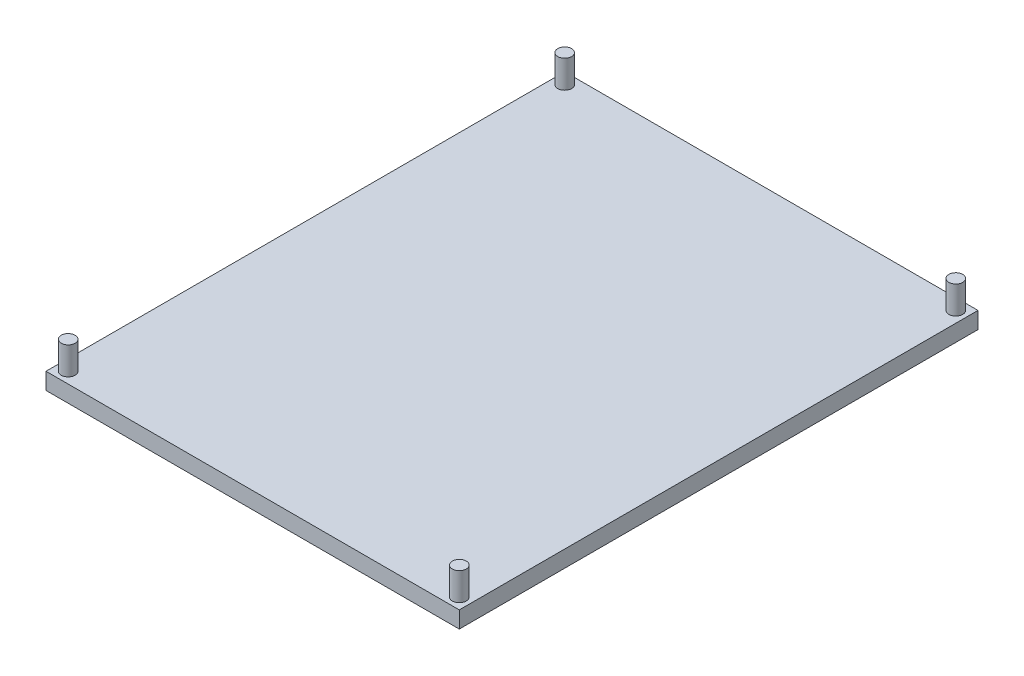
ISO-10303-21;
HEADER;
FILE_DESCRIPTION(('STEP AP214'),'2;1');
FILE_NAME('part.step','',(''),(''),'','','');
FILE_SCHEMA(('AUTOMOTIVE_DESIGN { 1 0 10303 214 1 1 1 1 }'));
ENDSEC;
DATA;
#1=APPLICATION_CONTEXT('core data for automotive mechanical design processes');
#2=APPLICATION_PROTOCOL_DEFINITION('international standard','automotive_design',2000,#1);
#3=PRODUCT_CONTEXT('',#1,'mechanical');
#4=PRODUCT('Part','Part','',(#3));
#5=PRODUCT_RELATED_PRODUCT_CATEGORY('part','',(#4));
#6=PRODUCT_DEFINITION_FORMATION('','',#4);
#7=PRODUCT_DEFINITION_CONTEXT('part definition',#1,'design');
#8=PRODUCT_DEFINITION('design','',#6,#7);
#9=PRODUCT_DEFINITION_SHAPE('','',#8);
#10=(LENGTH_UNIT() NAMED_UNIT(*) SI_UNIT(.MILLI.,.METRE.));
#11=(NAMED_UNIT(*) PLANE_ANGLE_UNIT() SI_UNIT($,.RADIAN.));
#12=(NAMED_UNIT(*) SI_UNIT($,.STERADIAN.) SOLID_ANGLE_UNIT());
#13=UNCERTAINTY_MEASURE_WITH_UNIT(LENGTH_MEASURE(1.E-05),#10,'distance_accuracy_value','');
#14=(GEOMETRIC_REPRESENTATION_CONTEXT(3) GLOBAL_UNCERTAINTY_ASSIGNED_CONTEXT((#13)) GLOBAL_UNIT_ASSIGNED_CONTEXT((#10,
#11,#12)) REPRESENTATION_CONTEXT('',''));
#15=CARTESIAN_POINT('',(0.,0.,0.));
#16=DIRECTION('',(0.,0.,1.));
#17=DIRECTION('',(1.,0.,0.));
#18=AXIS2_PLACEMENT_3D('',#15,#16,#17);
#19=CARTESIAN_POINT('',(37.25,3.,-46.75));
#20=DIRECTION('',(-1.,0.,0.));
#21=DIRECTION('',(0.,0.,1.));
#22=AXIS2_PLACEMENT_3D('',#19,#20,#21);
#23=PLANE('',#22);
#24=DIRECTION('',(0.,0.,-1.));
#25=VECTOR('',#24,1.);
#26=CARTESIAN_POINT('',(37.25,0.,-46.75));
#27=LINE('',#26,#25);
#28=CARTESIAN_POINT('',(37.25,0.,46.75));
#29=VERTEX_POINT('',#28);
#30=CARTESIAN_POINT('',(37.25,0.,-46.75));
#31=VERTEX_POINT('',#30);
#32=EDGE_CURVE('E111',#29,#31,#27,.T.);
#33=ORIENTED_EDGE('',*,*,#32,.T.);
#34=DIRECTION('',(0.,-1.,0.));
#35=VECTOR('',#34,1.);
#36=CARTESIAN_POINT('',(37.25,3.,-46.75));
#37=LINE('',#36,#35);
#38=CARTESIAN_POINT('',(37.25,3.,-46.75));
#39=VERTEX_POINT('',#38);
#40=EDGE_CURVE('E11',#39,#31,#37,.T.);
#41=ORIENTED_EDGE('',*,*,#40,.F.);
#42=DIRECTION('',(0.,0.,-1.));
#43=VECTOR('',#42,1.);
#44=CARTESIAN_POINT('',(37.25,3.,-46.75));
#45=LINE('',#44,#43);
#46=CARTESIAN_POINT('',(37.25,3.,46.75));
#47=VERTEX_POINT('',#46);
#48=EDGE_CURVE('E95',#47,#39,#45,.T.);
#49=ORIENTED_EDGE('',*,*,#48,.F.);
#50=DIRECTION('',(0.,-1.,0.));
#51=VECTOR('',#50,1.);
#52=CARTESIAN_POINT('',(37.25,3.,46.75));
#53=LINE('',#52,#51);
#54=EDGE_CURVE('E107',#47,#29,#53,.T.);
#55=ORIENTED_EDGE('',*,*,#54,.T.);
#56=EDGE_LOOP('',(#33,#41,#49,#55));
#57=FACE_BOUND('',#56,.T.);
#58=ADVANCED_FACE('F43',(#57),#23,.F.);
#59=CARTESIAN_POINT('',(-37.25,3.,-46.75));
#60=DIRECTION('',(0.,0.,1.));
#61=DIRECTION('',(1.,0.,0.));
#62=AXIS2_PLACEMENT_3D('',#59,#60,#61);
#63=PLANE('',#62);
#64=DIRECTION('',(-1.,0.,0.));
#65=VECTOR('',#64,1.);
#66=CARTESIAN_POINT('',(-37.25,0.,-46.75));
#67=LINE('',#66,#65);
#68=CARTESIAN_POINT('',(-37.25,0.,-46.75));
#69=VERTEX_POINT('',#68);
#70=EDGE_CURVE('E100',#31,#69,#67,.T.);
#71=ORIENTED_EDGE('',*,*,#70,.T.);
#72=DIRECTION('',(0.,-1.,0.));
#73=VECTOR('',#72,1.);
#74=CARTESIAN_POINT('',(-37.25,3.,-46.75));
#75=LINE('',#74,#73);
#76=CARTESIAN_POINT('',(-37.25,3.,-46.75));
#77=VERTEX_POINT('',#76);
#78=EDGE_CURVE('E52',#77,#69,#75,.T.);
#79=ORIENTED_EDGE('',*,*,#78,.F.);
#80=DIRECTION('',(-1.,0.,0.));
#81=VECTOR('',#80,1.);
#82=CARTESIAN_POINT('',(-37.25,3.,-46.75));
#83=LINE('',#82,#81);
#84=EDGE_CURVE('E90',#39,#77,#83,.T.);
#85=ORIENTED_EDGE('',*,*,#84,.F.);
#86=ORIENTED_EDGE('',*,*,#40,.T.);
#87=EDGE_LOOP('',(#71,#79,#85,#86));
#88=FACE_BOUND('',#87,.T.);
#89=ADVANCED_FACE('F99',(#88),#63,.F.);
#90=CARTESIAN_POINT('',(-37.25,3.,-46.75));
#91=DIRECTION('',(1.,0.,0.));
#92=DIRECTION('',(0.,0.,-1.));
#93=AXIS2_PLACEMENT_3D('',#90,#91,#92);
#94=PLANE('',#93);
#95=DIRECTION('',(0.,0.,1.));
#96=VECTOR('',#95,1.);
#97=CARTESIAN_POINT('',(-37.25,0.,-46.75));
#98=LINE('',#97,#96);
#99=CARTESIAN_POINT('',(-37.25,0.,46.75));
#100=VERTEX_POINT('',#99);
#101=EDGE_CURVE('E77',#69,#100,#98,.T.);
#102=ORIENTED_EDGE('',*,*,#101,.T.);
#103=DIRECTION('',(0.,-1.,0.));
#104=VECTOR('',#103,1.);
#105=CARTESIAN_POINT('',(-37.25,3.,46.75));
#106=LINE('',#105,#104);
#107=CARTESIAN_POINT('',(-37.25,3.,46.75));
#108=VERTEX_POINT('',#107);
#109=EDGE_CURVE('E102',#108,#100,#106,.T.);
#110=ORIENTED_EDGE('',*,*,#109,.F.);
#111=DIRECTION('',(0.,0.,1.));
#112=VECTOR('',#111,1.);
#113=CARTESIAN_POINT('',(-37.25,3.,-46.75));
#114=LINE('',#113,#112);
#115=EDGE_CURVE('E93',#77,#108,#114,.T.);
#116=ORIENTED_EDGE('',*,*,#115,.F.);
#117=ORIENTED_EDGE('',*,*,#78,.T.);
#118=EDGE_LOOP('',(#102,#110,#116,#117));
#119=FACE_BOUND('',#118,.T.);
#120=ADVANCED_FACE('F103',(#119),#94,.F.);
#121=CARTESIAN_POINT('',(-37.25,3.,46.75));
#122=DIRECTION('',(0.,0.,-1.));
#123=DIRECTION('',(-1.,0.,0.));
#124=AXIS2_PLACEMENT_3D('',#121,#122,#123);
#125=PLANE('',#124);
#126=DIRECTION('',(1.,0.,0.));
#127=VECTOR('',#126,1.);
#128=CARTESIAN_POINT('',(-37.25,0.,46.75));
#129=LINE('',#128,#127);
#130=EDGE_CURVE('E83',#100,#29,#129,.T.);
#131=ORIENTED_EDGE('',*,*,#130,.T.);
#132=ORIENTED_EDGE('',*,*,#54,.F.);
#133=DIRECTION('',(1.,0.,0.));
#134=VECTOR('',#133,1.);
#135=CARTESIAN_POINT('',(-37.25,3.,46.75));
#136=LINE('',#135,#134);
#137=EDGE_CURVE('E60',#108,#47,#136,.T.);
#138=ORIENTED_EDGE('',*,*,#137,.F.);
#139=ORIENTED_EDGE('',*,*,#109,.T.);
#140=EDGE_LOOP('',(#131,#132,#138,#139));
#141=FACE_BOUND('',#140,.T.);
#142=ADVANCED_FACE('F125',(#141),#125,.F.);
#143=CARTESIAN_POINT('',(0.,3.,0.));
#144=DIRECTION('',(0.,1.,0.));
#145=DIRECTION('',(0.,0.,1.));
#146=AXIS2_PLACEMENT_3D('',#143,#144,#145);
#147=PLANE('',#146);
#148=CARTESIAN_POINT('',(35.25,3.,44.75));
#149=DIRECTION('',(0.,1.,0.));
#150=DIRECTION('',(0.,0.,1.));
#151=AXIS2_PLACEMENT_3D('',#148,#149,#150);
#152=CIRCLE('',#151,1.25);
#153=CARTESIAN_POINT('',(35.25,3.,46.));
#154=VERTEX_POINT('',#153);
#155=EDGE_CURVE('E152',#154,#154,#152,.T.);
#156=ORIENTED_EDGE('',*,*,#155,.F.);
#157=EDGE_LOOP('',(#156));
#158=FACE_BOUND('',#157,.T.);
#159=CARTESIAN_POINT('',(-35.25,3.,44.75));
#160=DIRECTION('',(0.,1.,0.));
#161=DIRECTION('',(0.,0.,1.));
#162=AXIS2_PLACEMENT_3D('',#159,#160,#161);
#163=CIRCLE('',#162,1.25);
#164=CARTESIAN_POINT('',(-35.25,3.,46.));
#165=VERTEX_POINT('',#164);
#166=EDGE_CURVE('E144',#165,#165,#163,.T.);
#167=ORIENTED_EDGE('',*,*,#166,.F.);
#168=EDGE_LOOP('',(#167));
#169=FACE_BOUND('',#168,.T.);
#170=CARTESIAN_POINT('',(35.25,3.,-44.75));
#171=DIRECTION('',(0.,1.,0.));
#172=DIRECTION('',(0.,0.,1.));
#173=AXIS2_PLACEMENT_3D('',#170,#171,#172);
#174=CIRCLE('',#173,1.25);
#175=CARTESIAN_POINT('',(35.25,3.,-43.5));
#176=VERTEX_POINT('',#175);
#177=EDGE_CURVE('E136',#176,#176,#174,.T.);
#178=ORIENTED_EDGE('',*,*,#177,.F.);
#179=EDGE_LOOP('',(#178));
#180=FACE_BOUND('',#179,.T.);
#181=CARTESIAN_POINT('',(-35.25,3.,-44.75));
#182=DIRECTION('',(0.,1.,0.));
#183=DIRECTION('',(0.,0.,1.));
#184=AXIS2_PLACEMENT_3D('',#181,#182,#183);
#185=CIRCLE('',#184,1.25);
#186=CARTESIAN_POINT('',(-35.25,3.,-43.5));
#187=VERTEX_POINT('',#186);
#188=EDGE_CURVE('E132',#187,#187,#185,.T.);
#189=ORIENTED_EDGE('',*,*,#188,.F.);
#190=EDGE_LOOP('',(#189));
#191=FACE_BOUND('',#190,.T.);
#192=ORIENTED_EDGE('',*,*,#48,.T.);
#193=ORIENTED_EDGE('',*,*,#84,.T.);
#194=ORIENTED_EDGE('',*,*,#115,.T.);
#195=ORIENTED_EDGE('',*,*,#137,.T.);
#196=EDGE_LOOP('',(#192,#193,#194,#195));
#197=FACE_BOUND('',#196,.T.);
#198=ADVANCED_FACE('F91',(#158,#169,#180,#191,#197),#147,.T.);
#199=CARTESIAN_POINT('',(0.,0.,0.));
#200=DIRECTION('',(0.,1.,0.));
#201=DIRECTION('',(0.,0.,1.));
#202=AXIS2_PLACEMENT_3D('',#199,#200,#201);
#203=PLANE('',#202);
#204=ORIENTED_EDGE('',*,*,#32,.F.);
#205=ORIENTED_EDGE('',*,*,#130,.F.);
#206=ORIENTED_EDGE('',*,*,#101,.F.);
#207=ORIENTED_EDGE('',*,*,#70,.F.);
#208=EDGE_LOOP('',(#204,#205,#206,#207));
#209=FACE_BOUND('',#208,.T.);
#210=ADVANCED_FACE('F128',(#209),#203,.F.);
#211=CARTESIAN_POINT('',(-35.25,8.,-44.75));
#212=DIRECTION('',(0.,-1.,0.));
#213=DIRECTION('',(0.,0.,-1.));
#214=AXIS2_PLACEMENT_3D('',#211,#212,#213);
#215=CYLINDRICAL_SURFACE('',#214,1.25);
#216=CARTESIAN_POINT('',(-35.25,8.,-44.75));
#217=DIRECTION('',(0.,1.,0.));
#218=DIRECTION('',(0.,0.,1.));
#219=AXIS2_PLACEMENT_3D('',#216,#217,#218);
#220=CIRCLE('',#219,1.25);
#221=CARTESIAN_POINT('',(-35.25,8.,-43.5));
#222=VERTEX_POINT('',#221);
#223=EDGE_CURVE('E115',#222,#222,#220,.T.);
#224=ORIENTED_EDGE('',*,*,#223,.F.);
#225=EDGE_LOOP('',(#224));
#226=FACE_BOUND('',#225,.T.);
#227=ORIENTED_EDGE('',*,*,#188,.T.);
#228=EDGE_LOOP('',(#227));
#229=FACE_BOUND('',#228,.T.);
#230=ADVANCED_FACE('F175',(#226,#229),#215,.T.);
#231=CARTESIAN_POINT('',(-35.25,8.,-44.75));
#232=DIRECTION('',(0.,1.,0.));
#233=DIRECTION('',(0.,0.,1.));
#234=AXIS2_PLACEMENT_3D('',#231,#232,#233);
#235=PLANE('',#234);
#236=ORIENTED_EDGE('',*,*,#223,.T.);
#237=EDGE_LOOP('',(#236));
#238=FACE_BOUND('',#237,.T.);
#239=ADVANCED_FACE('F177',(#238),#235,.T.);
#240=CARTESIAN_POINT('',(35.25,8.,-44.75));
#241=DIRECTION('',(0.,-1.,0.));
#242=DIRECTION('',(0.,0.,-1.));
#243=AXIS2_PLACEMENT_3D('',#240,#241,#242);
#244=CYLINDRICAL_SURFACE('',#243,1.25);
#245=CARTESIAN_POINT('',(35.25,8.,-44.75));
#246=DIRECTION('',(0.,1.,0.));
#247=DIRECTION('',(0.,0.,1.));
#248=AXIS2_PLACEMENT_3D('',#245,#246,#247);
#249=CIRCLE('',#248,1.25);
#250=CARTESIAN_POINT('',(35.25,8.,-43.5));
#251=VERTEX_POINT('',#250);
#252=EDGE_CURVE('E140',#251,#251,#249,.T.);
#253=ORIENTED_EDGE('',*,*,#252,.F.);
#254=EDGE_LOOP('',(#253));
#255=FACE_BOUND('',#254,.T.);
#256=ORIENTED_EDGE('',*,*,#177,.T.);
#257=EDGE_LOOP('',(#256));
#258=FACE_BOUND('',#257,.T.);
#259=ADVANCED_FACE('F184',(#255,#258),#244,.T.);
#260=CARTESIAN_POINT('',(35.25,8.,-44.75));
#261=DIRECTION('',(0.,1.,0.));
#262=DIRECTION('',(0.,0.,1.));
#263=AXIS2_PLACEMENT_3D('',#260,#261,#262);
#264=PLANE('',#263);
#265=ORIENTED_EDGE('',*,*,#252,.T.);
#266=EDGE_LOOP('',(#265));
#267=FACE_BOUND('',#266,.T.);
#268=ADVANCED_FACE('F240',(#267),#264,.T.);
#269=CARTESIAN_POINT('',(-35.25,8.,44.75));
#270=DIRECTION('',(0.,-1.,0.));
#271=DIRECTION('',(0.,0.,-1.));
#272=AXIS2_PLACEMENT_3D('',#269,#270,#271);
#273=CYLINDRICAL_SURFACE('',#272,1.25);
#274=CARTESIAN_POINT('',(-35.25,8.,44.75));
#275=DIRECTION('',(0.,1.,0.));
#276=DIRECTION('',(0.,0.,1.));
#277=AXIS2_PLACEMENT_3D('',#274,#275,#276);
#278=CIRCLE('',#277,1.25);
#279=CARTESIAN_POINT('',(-35.25,8.,46.));
#280=VERTEX_POINT('',#279);
#281=EDGE_CURVE('E148',#280,#280,#278,.T.);
#282=ORIENTED_EDGE('',*,*,#281,.F.);
#283=EDGE_LOOP('',(#282));
#284=FACE_BOUND('',#283,.T.);
#285=ORIENTED_EDGE('',*,*,#166,.T.);
#286=EDGE_LOOP('',(#285));
#287=FACE_BOUND('',#286,.T.);
#288=ADVANCED_FACE('F251',(#284,#287),#273,.T.);
#289=CARTESIAN_POINT('',(-35.25,8.,44.75));
#290=DIRECTION('',(0.,1.,0.));
#291=DIRECTION('',(0.,0.,1.));
#292=AXIS2_PLACEMENT_3D('',#289,#290,#291);
#293=PLANE('',#292);
#294=ORIENTED_EDGE('',*,*,#281,.T.);
#295=EDGE_LOOP('',(#294));
#296=FACE_BOUND('',#295,.T.);
#297=ADVANCED_FACE('F262',(#296),#293,.T.);
#298=CARTESIAN_POINT('',(35.25,8.,44.75));
#299=DIRECTION('',(0.,-1.,0.));
#300=DIRECTION('',(0.,0.,-1.));
#301=AXIS2_PLACEMENT_3D('',#298,#299,#300);
#302=CYLINDRICAL_SURFACE('',#301,1.25);
#303=CARTESIAN_POINT('',(35.25,8.,44.75));
#304=DIRECTION('',(0.,1.,0.));
#305=DIRECTION('',(0.,0.,1.));
#306=AXIS2_PLACEMENT_3D('',#303,#304,#305);
#307=CIRCLE('',#306,1.25);
#308=CARTESIAN_POINT('',(35.25,8.,46.));
#309=VERTEX_POINT('',#308);
#310=EDGE_CURVE('E156',#309,#309,#307,.T.);
#311=ORIENTED_EDGE('',*,*,#310,.F.);
#312=EDGE_LOOP('',(#311));
#313=FACE_BOUND('',#312,.T.);
#314=ORIENTED_EDGE('',*,*,#155,.T.);
#315=EDGE_LOOP('',(#314));
#316=FACE_BOUND('',#315,.T.);
#317=ADVANCED_FACE('F164',(#313,#316),#302,.T.);
#318=CARTESIAN_POINT('',(35.25,8.,44.75));
#319=DIRECTION('',(0.,1.,0.));
#320=DIRECTION('',(0.,0.,1.));
#321=AXIS2_PLACEMENT_3D('',#318,#319,#320);
#322=PLANE('',#321);
#323=ORIENTED_EDGE('',*,*,#310,.T.);
#324=EDGE_LOOP('',(#323));
#325=FACE_BOUND('',#324,.T.);
#326=ADVANCED_FACE('F283',(#325),#322,.T.);
#327=CLOSED_SHELL('',(#58,#89,#120,#142,#198,#210,#230,#239,#259,#268,#288,#297,#317,#326));
#328=MANIFOLD_SOLID_BREP('B2',#327);
#329=ADVANCED_BREP_SHAPE_REPRESENTATION('',(#18,#328),#14);
#330=SHAPE_DEFINITION_REPRESENTATION(#9,#329);
ENDSEC;
END-ISO-10303-21;
